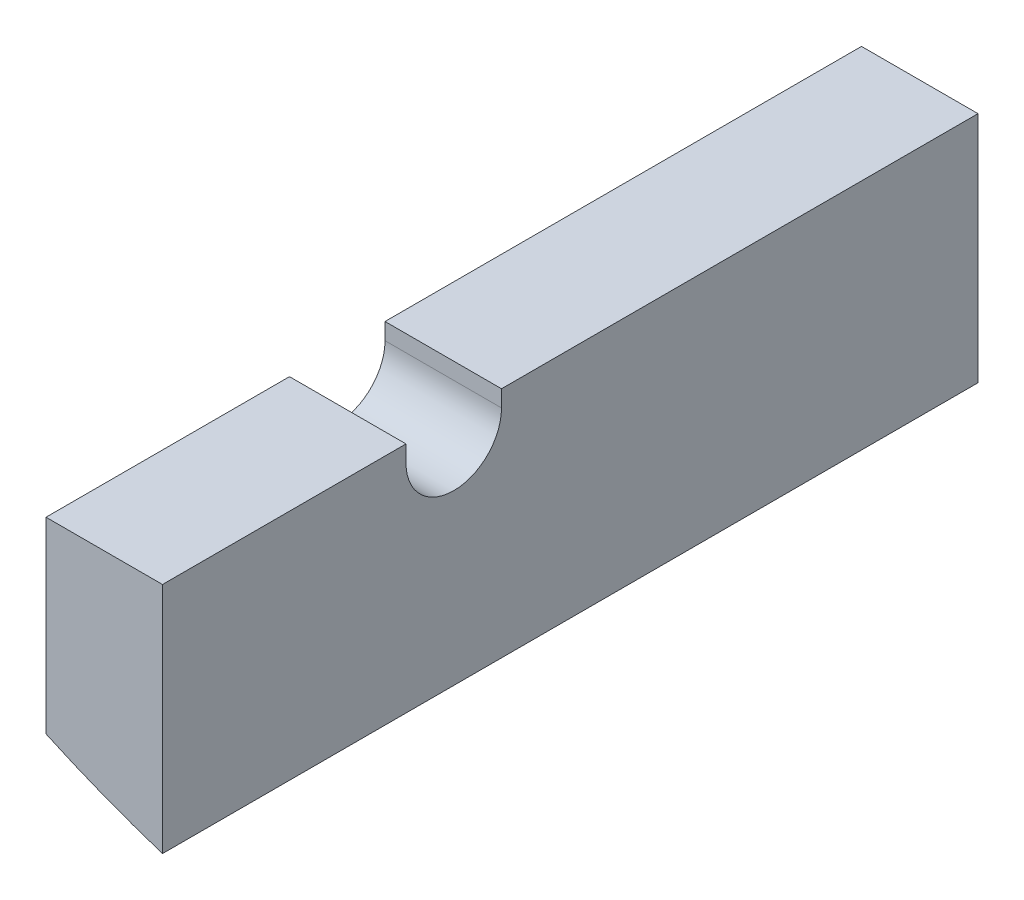
ISO-10303-21;
HEADER;
FILE_DESCRIPTION(('STEP AP214'),'2;1');
FILE_NAME('part.step','',(''),(''),'','','');
FILE_SCHEMA(('AUTOMOTIVE_DESIGN { 1 0 10303 214 1 1 1 1 }'));
ENDSEC;
DATA;
#1=APPLICATION_CONTEXT('core data for automotive mechanical design processes');
#2=APPLICATION_PROTOCOL_DEFINITION('international standard','automotive_design',2000,#1);
#3=PRODUCT_CONTEXT('',#1,'mechanical');
#4=PRODUCT('Part','Part','',(#3));
#5=PRODUCT_RELATED_PRODUCT_CATEGORY('part','',(#4));
#6=PRODUCT_DEFINITION_FORMATION('','',#4);
#7=PRODUCT_DEFINITION_CONTEXT('part definition',#1,'design');
#8=PRODUCT_DEFINITION('design','',#6,#7);
#9=PRODUCT_DEFINITION_SHAPE('','',#8);
#10=(LENGTH_UNIT() NAMED_UNIT(*) SI_UNIT(.MILLI.,.METRE.));
#11=(NAMED_UNIT(*) PLANE_ANGLE_UNIT() SI_UNIT($,.RADIAN.));
#12=(NAMED_UNIT(*) SI_UNIT($,.STERADIAN.) SOLID_ANGLE_UNIT());
#13=UNCERTAINTY_MEASURE_WITH_UNIT(LENGTH_MEASURE(1.E-05),#10,'distance_accuracy_value','');
#14=(GEOMETRIC_REPRESENTATION_CONTEXT(3) GLOBAL_UNCERTAINTY_ASSIGNED_CONTEXT((#13)) GLOBAL_UNIT_ASSIGNED_CONTEXT((#10,
#11,#12)) REPRESENTATION_CONTEXT('',''));
#15=CARTESIAN_POINT('',(0.,0.,0.));
#16=DIRECTION('',(0.,0.,1.));
#17=DIRECTION('',(1.,0.,0.));
#18=AXIS2_PLACEMENT_3D('',#15,#16,#17);
#19=CARTESIAN_POINT('',(-19.,-41.3430768085783,35.));
#20=DIRECTION('',(1.,0.,0.));
#21=DIRECTION('',(0.,0.,-1.));
#22=AXIS2_PLACEMENT_3D('',#19,#20,#21);
#23=PLANE('',#22);
#24=DIRECTION('',(0.,-1.,0.));
#25=VECTOR('',#24,1.);
#26=CARTESIAN_POINT('',(-19.,-41.3430768085783,35.));
#27=LINE('',#26,#25);
#28=CARTESIAN_POINT('',(-19.,-33.2889759550743,35.));
#29=VERTEX_POINT('',#28);
#30=CARTESIAN_POINT('',(-19.,-41.3430768085783,35.));
#31=VERTEX_POINT('',#30);
#32=EDGE_CURVE('E142',#29,#31,#27,.T.);
#33=ORIENTED_EDGE('',*,*,#32,.F.);
#34=DIRECTION('',(0.,0.,1.));
#35=VECTOR('',#34,1.);
#36=CARTESIAN_POINT('',(-19.,-33.2889759550743,0.));
#37=LINE('',#36,#35);
#38=CARTESIAN_POINT('',(-19.,-33.2889759550743,24.55));
#39=VERTEX_POINT('',#38);
#40=EDGE_CURVE('E121',#39,#29,#37,.T.);
#41=ORIENTED_EDGE('',*,*,#40,.F.);
#42=DIRECTION('',(0.,1.,0.));
#43=VECTOR('',#42,1.);
#44=CARTESIAN_POINT('',(-19.,-34.0026090689854,24.55));
#45=LINE('',#44,#43);
#46=CARTESIAN_POINT('',(-19.,-34.0026090689854,24.55));
#47=VERTEX_POINT('',#46);
#48=EDGE_CURVE('E167',#47,#39,#45,.T.);
#49=ORIENTED_EDGE('',*,*,#48,.F.);
#50=CARTESIAN_POINT('',(-19.,-34.0026090689854,22.5));
#51=DIRECTION('',(-1.,0.,0.));
#52=DIRECTION('',(0.,0.,1.));
#53=AXIS2_PLACEMENT_3D('',#50,#51,#52);
#54=CIRCLE('',#53,2.05000000000001);
#55=CARTESIAN_POINT('',(-19.,-34.0026090689854,20.45));
#56=VERTEX_POINT('',#55);
#57=EDGE_CURVE('E170',#56,#47,#54,.T.);
#58=ORIENTED_EDGE('',*,*,#57,.F.);
#59=DIRECTION('',(0.,-1.,0.));
#60=VECTOR('',#59,1.);
#61=CARTESIAN_POINT('',(-19.,-34.0026090689854,20.45));
#62=LINE('',#61,#60);
#63=CARTESIAN_POINT('',(-19.,-33.2889759550743,20.45));
#64=VERTEX_POINT('',#63);
#65=EDGE_CURVE('E119',#64,#56,#62,.T.);
#66=ORIENTED_EDGE('',*,*,#65,.F.);
#67=CARTESIAN_POINT('',(-19.,-33.2889759550743,0.));
#68=VERTEX_POINT('',#67);
#69=EDGE_CURVE('E54',#68,#64,#37,.T.);
#70=ORIENTED_EDGE('',*,*,#69,.F.);
#71=DIRECTION('',(0.,-1.,0.));
#72=VECTOR('',#71,1.);
#73=CARTESIAN_POINT('',(-19.,-41.3430768085783,0.));
#74=LINE('',#73,#72);
#75=CARTESIAN_POINT('',(-19.,-41.3430768085783,0.));
#76=VERTEX_POINT('',#75);
#77=EDGE_CURVE('E116',#68,#76,#74,.T.);
#78=ORIENTED_EDGE('',*,*,#77,.T.);
#79=DIRECTION('',(0.,0.,-1.));
#80=VECTOR('',#79,1.);
#81=CARTESIAN_POINT('',(-19.,-41.3430768085783,35.));
#82=LINE('',#81,#80);
#83=EDGE_CURVE('E47',#31,#76,#82,.T.);
#84=ORIENTED_EDGE('',*,*,#83,.F.);
#85=EDGE_LOOP('',(#33,#41,#49,#58,#66,#70,#78,#84));
#86=FACE_BOUND('',#85,.T.);
#87=ADVANCED_FACE('F39',(#86),#23,.F.);
#88=CARTESIAN_POINT('',(0.,0.,35.));
#89=DIRECTION('',(0.,0.,-1.));
#90=DIRECTION('',(-1.,0.,0.));
#91=AXIS2_PLACEMENT_3D('',#88,#89,#90);
#92=CYLINDRICAL_SURFACE('',#91,45.5);
#93=CARTESIAN_POINT('',(0.,0.,0.));
#94=DIRECTION('',(0.,0.,1.));
#95=DIRECTION('',(1.,0.,0.));
#96=AXIS2_PLACEMENT_3D('',#93,#94,#95);
#97=CIRCLE('',#96,45.5);
#98=CARTESIAN_POINT('',(-14.,-43.2926090689854,0.));
#99=VERTEX_POINT('',#98);
#100=EDGE_CURVE('E125',#76,#99,#97,.T.);
#101=ORIENTED_EDGE('',*,*,#100,.T.);
#102=DIRECTION('',(0.,0.,-1.));
#103=VECTOR('',#102,1.);
#104=CARTESIAN_POINT('',(-14.,-43.2926090689854,35.));
#105=LINE('',#104,#103);
#106=CARTESIAN_POINT('',(-14.,-43.2926090689854,35.));
#107=VERTEX_POINT('',#106);
#108=EDGE_CURVE('E143',#107,#99,#105,.T.);
#109=ORIENTED_EDGE('',*,*,#108,.F.);
#110=CARTESIAN_POINT('',(0.,0.,35.));
#111=DIRECTION('',(0.,0.,1.));
#112=DIRECTION('',(1.,0.,0.));
#113=AXIS2_PLACEMENT_3D('',#110,#111,#112);
#114=CIRCLE('',#113,45.5);
#115=EDGE_CURVE('E151',#31,#107,#114,.T.);
#116=ORIENTED_EDGE('',*,*,#115,.F.);
#117=ORIENTED_EDGE('',*,*,#83,.T.);
#118=EDGE_LOOP('',(#101,#109,#116,#117));
#119=FACE_BOUND('',#118,.T.);
#120=ADVANCED_FACE('F149',(#119),#92,.T.);
#121=CARTESIAN_POINT('',(-14.,-32.2926090689854,35.));
#122=DIRECTION('',(-1.,0.,0.));
#123=DIRECTION('',(0.,0.,1.));
#124=AXIS2_PLACEMENT_3D('',#121,#122,#123);
#125=PLANE('',#124);
#126=DIRECTION('',(0.,1.,0.));
#127=VECTOR('',#126,1.);
#128=CARTESIAN_POINT('',(-14.,-32.2926090689854,0.));
#129=LINE('',#128,#127);
#130=CARTESIAN_POINT('',(-14.,-33.2889759550743,0.));
#131=VERTEX_POINT('',#130);
#132=EDGE_CURVE('E131',#99,#131,#129,.T.);
#133=ORIENTED_EDGE('',*,*,#132,.T.);
#134=DIRECTION('',(0.,0.,1.));
#135=VECTOR('',#134,1.);
#136=CARTESIAN_POINT('',(-14.,-33.2889759550743,35.));
#137=LINE('',#136,#135);
#138=CARTESIAN_POINT('',(-14.,-33.2889759550743,20.45));
#139=VERTEX_POINT('',#138);
#140=EDGE_CURVE('E104',#131,#139,#137,.T.);
#141=ORIENTED_EDGE('',*,*,#140,.T.);
#142=DIRECTION('',(0.,-1.,0.));
#143=VECTOR('',#142,1.);
#144=CARTESIAN_POINT('',(-14.,-34.0026090689854,20.45));
#145=LINE('',#144,#143);
#146=CARTESIAN_POINT('',(-14.,-34.0026090689854,20.45));
#147=VERTEX_POINT('',#146);
#148=EDGE_CURVE('E162',#139,#147,#145,.T.);
#149=ORIENTED_EDGE('',*,*,#148,.T.);
#150=CARTESIAN_POINT('',(-14.,-34.0026090689854,22.5));
#151=DIRECTION('',(-1.,0.,0.));
#152=DIRECTION('',(0.,0.,1.));
#153=AXIS2_PLACEMENT_3D('',#150,#151,#152);
#154=CIRCLE('',#153,2.05000000000001);
#155=CARTESIAN_POINT('',(-14.,-34.0026090689854,24.55));
#156=VERTEX_POINT('',#155);
#157=EDGE_CURVE('E166',#147,#156,#154,.T.);
#158=ORIENTED_EDGE('',*,*,#157,.T.);
#159=DIRECTION('',(0.,1.,0.));
#160=VECTOR('',#159,1.);
#161=CARTESIAN_POINT('',(-14.,-34.0026090689854,24.55));
#162=LINE('',#161,#160);
#163=CARTESIAN_POINT('',(-14.,-33.2889759550743,24.55));
#164=VERTEX_POINT('',#163);
#165=EDGE_CURVE('E176',#156,#164,#162,.T.);
#166=ORIENTED_EDGE('',*,*,#165,.T.);
#167=CARTESIAN_POINT('',(-14.,-33.2889759550743,35.));
#168=VERTEX_POINT('',#167);
#169=EDGE_CURVE('E62',#164,#168,#137,.T.);
#170=ORIENTED_EDGE('',*,*,#169,.T.);
#171=DIRECTION('',(0.,1.,0.));
#172=VECTOR('',#171,1.);
#173=CARTESIAN_POINT('',(-14.,-32.2926090689854,35.));
#174=LINE('',#173,#172);
#175=EDGE_CURVE('E137',#107,#168,#174,.T.);
#176=ORIENTED_EDGE('',*,*,#175,.F.);
#177=ORIENTED_EDGE('',*,*,#108,.T.);
#178=EDGE_LOOP('',(#133,#141,#149,#158,#166,#170,#176,#177));
#179=FACE_BOUND('',#178,.T.);
#180=ADVANCED_FACE('F194',(#179),#125,.F.);
#181=CARTESIAN_POINT('',(0.,0.,35.));
#182=DIRECTION('',(0.,0.,1.));
#183=DIRECTION('',(1.,0.,0.));
#184=AXIS2_PLACEMENT_3D('',#181,#182,#183);
#185=PLANE('',#184);
#186=DIRECTION('',(-1.,0.,0.));
#187=VECTOR('',#186,1.);
#188=CARTESIAN_POINT('',(16.,-33.2889759550743,35.));
#189=LINE('',#188,#187);
#190=EDGE_CURVE('E110',#168,#29,#189,.T.);
#191=ORIENTED_EDGE('',*,*,#190,.T.);
#192=ORIENTED_EDGE('',*,*,#32,.T.);
#193=ORIENTED_EDGE('',*,*,#115,.T.);
#194=ORIENTED_EDGE('',*,*,#175,.T.);
#195=EDGE_LOOP('',(#191,#192,#193,#194));
#196=FACE_BOUND('',#195,.T.);
#197=ADVANCED_FACE('F190',(#196),#185,.T.);
#198=CARTESIAN_POINT('',(0.,0.,0.));
#199=DIRECTION('',(0.,0.,1.));
#200=DIRECTION('',(1.,0.,0.));
#201=AXIS2_PLACEMENT_3D('',#198,#199,#200);
#202=PLANE('',#201);
#203=ORIENTED_EDGE('',*,*,#77,.F.);
#204=DIRECTION('',(-1.,0.,0.));
#205=VECTOR('',#204,1.);
#206=CARTESIAN_POINT('',(16.,-33.2889759550743,0.));
#207=LINE('',#206,#205);
#208=EDGE_CURVE('E101',#131,#68,#207,.T.);
#209=ORIENTED_EDGE('',*,*,#208,.F.);
#210=ORIENTED_EDGE('',*,*,#132,.F.);
#211=ORIENTED_EDGE('',*,*,#100,.F.);
#212=EDGE_LOOP('',(#203,#209,#210,#211));
#213=FACE_BOUND('',#212,.T.);
#214=ADVANCED_FACE('F124',(#213),#202,.F.);
#215=CARTESIAN_POINT('',(-14.,-34.0026090689854,22.5));
#216=DIRECTION('',(-1.,0.,0.));
#217=DIRECTION('',(0.,0.,1.));
#218=AXIS2_PLACEMENT_3D('',#215,#216,#217);
#219=CYLINDRICAL_SURFACE('',#218,2.05000000000001);
#220=ORIENTED_EDGE('',*,*,#57,.T.);
#221=DIRECTION('',(-1.,0.,0.));
#222=VECTOR('',#221,1.);
#223=CARTESIAN_POINT('',(-14.,-34.0026090689854,24.55));
#224=LINE('',#223,#222);
#225=EDGE_CURVE('E134',#156,#47,#224,.T.);
#226=ORIENTED_EDGE('',*,*,#225,.F.);
#227=ORIENTED_EDGE('',*,*,#157,.F.);
#228=DIRECTION('',(-1.,0.,0.));
#229=VECTOR('',#228,1.);
#230=CARTESIAN_POINT('',(-14.,-34.0026090689854,20.45));
#231=LINE('',#230,#229);
#232=EDGE_CURVE('E127',#147,#56,#231,.T.);
#233=ORIENTED_EDGE('',*,*,#232,.T.);
#234=EDGE_LOOP('',(#220,#226,#227,#233));
#235=FACE_BOUND('',#234,.T.);
#236=ADVANCED_FACE('F200',(#235),#219,.F.);
#237=CARTESIAN_POINT('',(-14.,-34.0026090689854,20.45));
#238=DIRECTION('',(0.,0.,-1.));
#239=DIRECTION('',(0.,1.,0.));
#240=AXIS2_PLACEMENT_3D('',#237,#238,#239);
#241=PLANE('',#240);
#242=ORIENTED_EDGE('',*,*,#148,.F.);
#243=DIRECTION('',(-1.,0.,0.));
#244=VECTOR('',#243,1.);
#245=CARTESIAN_POINT('',(-14.,-33.2889759550743,20.45));
#246=LINE('',#245,#244);
#247=EDGE_CURVE('E183',#139,#64,#246,.T.);
#248=ORIENTED_EDGE('',*,*,#247,.T.);
#249=ORIENTED_EDGE('',*,*,#65,.T.);
#250=ORIENTED_EDGE('',*,*,#232,.F.);
#251=EDGE_LOOP('',(#242,#248,#249,#250));
#252=FACE_BOUND('',#251,.T.);
#253=ADVANCED_FACE('F204',(#252),#241,.F.);
#254=CARTESIAN_POINT('',(-14.,-34.0026090689854,24.55));
#255=DIRECTION('',(0.,0.,1.));
#256=DIRECTION('',(0.,-1.,0.));
#257=AXIS2_PLACEMENT_3D('',#254,#255,#256);
#258=PLANE('',#257);
#259=ORIENTED_EDGE('',*,*,#48,.T.);
#260=DIRECTION('',(1.,0.,0.));
#261=VECTOR('',#260,1.);
#262=CARTESIAN_POINT('',(-14.,-33.2889759550743,24.55));
#263=LINE('',#262,#261);
#264=EDGE_CURVE('E11',#39,#164,#263,.T.);
#265=ORIENTED_EDGE('',*,*,#264,.T.);
#266=ORIENTED_EDGE('',*,*,#165,.F.);
#267=ORIENTED_EDGE('',*,*,#225,.T.);
#268=EDGE_LOOP('',(#259,#265,#266,#267));
#269=FACE_BOUND('',#268,.T.);
#270=ADVANCED_FACE('F198',(#269),#258,.F.);
#271=CARTESIAN_POINT('',(16.,-33.2889759550743,0.));
#272=DIRECTION('',(0.,-1.,0.));
#273=DIRECTION('',(0.,0.,-1.));
#274=AXIS2_PLACEMENT_3D('',#271,#272,#273);
#275=PLANE('',#274);
#276=ORIENTED_EDGE('',*,*,#264,.F.);
#277=ORIENTED_EDGE('',*,*,#40,.T.);
#278=ORIENTED_EDGE('',*,*,#190,.F.);
#279=ORIENTED_EDGE('',*,*,#169,.F.);
#280=EDGE_LOOP('',(#276,#277,#278,#279));
#281=FACE_BOUND('',#280,.T.);
#282=ADVANCED_FACE('F192',(#281),#275,.F.);
#283=ORIENTED_EDGE('',*,*,#208,.T.);
#284=ORIENTED_EDGE('',*,*,#69,.T.);
#285=ORIENTED_EDGE('',*,*,#247,.F.);
#286=ORIENTED_EDGE('',*,*,#140,.F.);
#287=EDGE_LOOP('',(#283,#284,#285,#286));
#288=FACE_BOUND('',#287,.T.);
#289=ADVANCED_FACE('F102',(#288),#275,.F.);
#290=CLOSED_SHELL('',(#87,#120,#180,#197,#214,#236,#253,#270,#282,#289));
#291=MANIFOLD_SOLID_BREP('B2',#290);
#292=ADVANCED_BREP_SHAPE_REPRESENTATION('',(#18,#291),#14);
#293=SHAPE_DEFINITION_REPRESENTATION(#9,#292);
ENDSEC;
END-ISO-10303-21;
